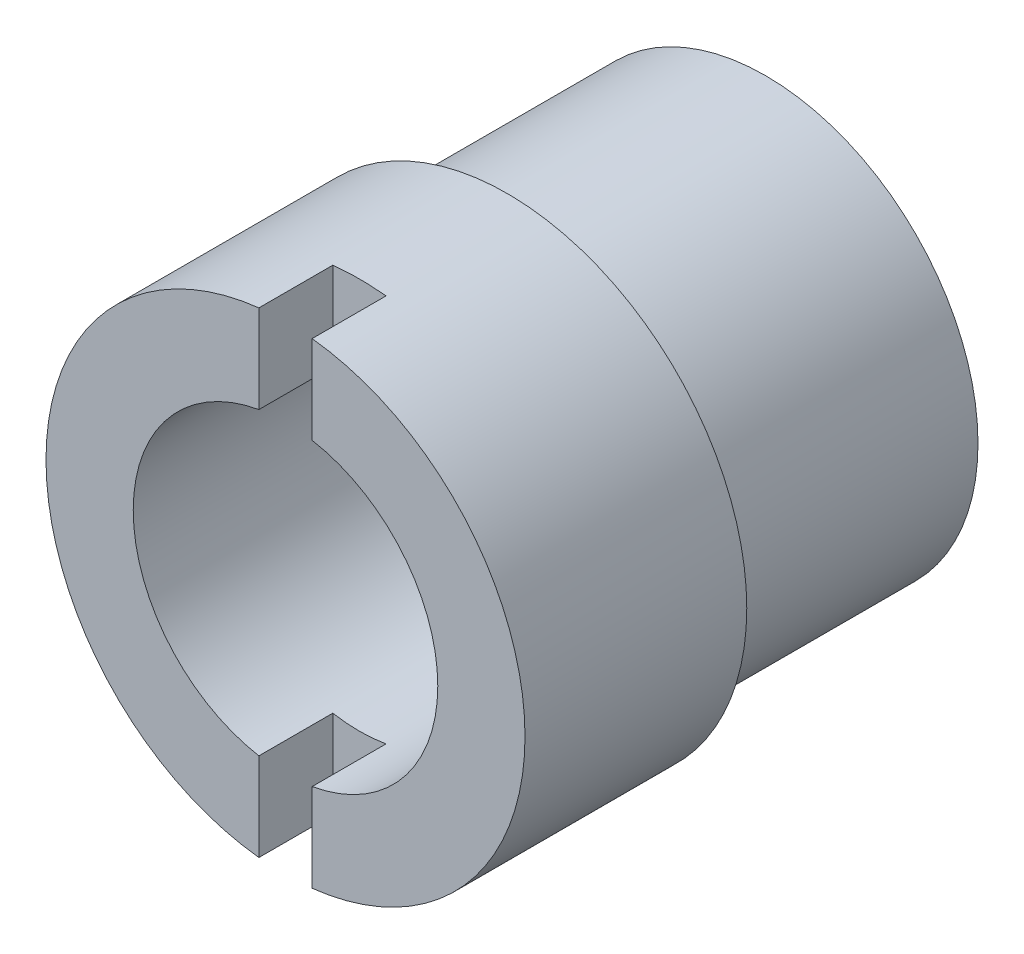
ISO-10303-21;
HEADER;
FILE_DESCRIPTION(('STEP AP214'),'2;1');
FILE_NAME('part.step','',(''),(''),'','','');
FILE_SCHEMA(('AUTOMOTIVE_DESIGN { 1 0 10303 214 1 1 1 1 }'));
ENDSEC;
DATA;
#1=APPLICATION_CONTEXT('core data for automotive mechanical design processes');
#2=APPLICATION_PROTOCOL_DEFINITION('international standard','automotive_design',2000,#1);
#3=PRODUCT_CONTEXT('',#1,'mechanical');
#4=PRODUCT('Part','Part','',(#3));
#5=PRODUCT_RELATED_PRODUCT_CATEGORY('part','',(#4));
#6=PRODUCT_DEFINITION_FORMATION('','',#4);
#7=PRODUCT_DEFINITION_CONTEXT('part definition',#1,'design');
#8=PRODUCT_DEFINITION('design','',#6,#7);
#9=PRODUCT_DEFINITION_SHAPE('','',#8);
#10=(LENGTH_UNIT() NAMED_UNIT(*) SI_UNIT(.MILLI.,.METRE.));
#11=(NAMED_UNIT(*) PLANE_ANGLE_UNIT() SI_UNIT($,.RADIAN.));
#12=(NAMED_UNIT(*) SI_UNIT($,.STERADIAN.) SOLID_ANGLE_UNIT());
#13=UNCERTAINTY_MEASURE_WITH_UNIT(LENGTH_MEASURE(1.E-05),#10,'distance_accuracy_value','');
#14=(GEOMETRIC_REPRESENTATION_CONTEXT(3) GLOBAL_UNCERTAINTY_ASSIGNED_CONTEXT((#13)) GLOBAL_UNIT_ASSIGNED_CONTEXT((#10,
#11,#12)) REPRESENTATION_CONTEXT('',''));
#15=CARTESIAN_POINT('',(0.,0.,0.));
#16=DIRECTION('',(0.,0.,1.));
#17=DIRECTION('',(1.,0.,0.));
#18=AXIS2_PLACEMENT_3D('',#15,#16,#17);
#19=CARTESIAN_POINT('',(0.,0.,0.));
#20=DIRECTION('',(0.,0.,1.));
#21=DIRECTION('',(1.,0.,0.));
#22=AXIS2_PLACEMENT_3D('',#19,#20,#21);
#23=PLANE('',#22);
#24=DIRECTION('',(0.,1.,0.));
#25=VECTOR('',#24,1.);
#26=CARTESIAN_POINT('',(-1.143,-14.4399,0.));
#27=LINE('',#26,#25);
#28=CARTESIAN_POINT('',(-1.143,6.43985180341908,0.));
#29=VERTEX_POINT('',#28);
#30=CARTESIAN_POINT('',(-1.143,10.223302793129,0.));
#31=VERTEX_POINT('',#30);
#32=EDGE_CURVE('E129',#29,#31,#27,.T.);
#33=ORIENTED_EDGE('',*,*,#32,.T.);
#34=CARTESIAN_POINT('',(0.,0.,0.));
#35=DIRECTION('',(0.,0.,1.));
#36=DIRECTION('',(1.,0.,0.));
#37=AXIS2_PLACEMENT_3D('',#34,#35,#36);
#38=CIRCLE('',#37,10.287);
#39=CARTESIAN_POINT('',(-1.143,-10.223302793129,0.));
#40=VERTEX_POINT('',#39);
#41=EDGE_CURVE('E136',#31,#40,#38,.T.);
#42=ORIENTED_EDGE('',*,*,#41,.T.);
#43=CARTESIAN_POINT('',(-1.143,-6.43985180341908,0.));
#44=VERTEX_POINT('',#43);
#45=EDGE_CURVE('E115',#40,#44,#27,.T.);
#46=ORIENTED_EDGE('',*,*,#45,.T.);
#47=CARTESIAN_POINT('',(0.,0.,0.));
#48=DIRECTION('',(0.,0.,1.));
#49=DIRECTION('',(1.,0.,0.));
#50=AXIS2_PLACEMENT_3D('',#47,#48,#49);
#51=CIRCLE('',#50,6.5405);
#52=EDGE_CURVE('E154',#29,#44,#51,.T.);
#53=ORIENTED_EDGE('',*,*,#52,.F.);
#54=EDGE_LOOP('',(#33,#42,#46,#53));
#55=FACE_BOUND('',#54,.T.);
#56=ADVANCED_FACE('F50',(#55),#23,.T.);
#57=CARTESIAN_POINT('',(0.,0.,-9.525));
#58=DIRECTION('',(0.,0.,1.));
#59=DIRECTION('',(1.,0.,0.));
#60=AXIS2_PLACEMENT_3D('',#57,#58,#59);
#61=CYLINDRICAL_SURFACE('',#60,10.287);
#62=DIRECTION('',(0.,0.,1.));
#63=VECTOR('',#62,1.);
#64=CARTESIAN_POINT('',(-1.143,10.223302793129,-9.525));
#65=LINE('',#64,#63);
#66=CARTESIAN_POINT('',(-1.143,10.223302793129,-3.175));
#67=VERTEX_POINT('',#66);
#68=EDGE_CURVE('E141',#67,#31,#65,.T.);
#69=ORIENTED_EDGE('',*,*,#68,.F.);
#70=CARTESIAN_POINT('',(0.,0.,-3.175));
#71=DIRECTION('',(0.,0.,-1.));
#72=DIRECTION('',(-1.,0.,0.));
#73=AXIS2_PLACEMENT_3D('',#70,#71,#72);
#74=CIRCLE('',#73,10.287);
#75=CARTESIAN_POINT('',(1.143,10.223302793129,-3.175));
#76=VERTEX_POINT('',#75);
#77=EDGE_CURVE('E180',#76,#67,#74,.F.);
#78=ORIENTED_EDGE('',*,*,#77,.F.);
#79=DIRECTION('',(0.,0.,1.));
#80=VECTOR('',#79,1.);
#81=CARTESIAN_POINT('',(1.143,10.223302793129,-9.525));
#82=LINE('',#81,#80);
#83=CARTESIAN_POINT('',(1.143,10.223302793129,0.));
#84=VERTEX_POINT('',#83);
#85=EDGE_CURVE('E198',#84,#76,#82,.F.);
#86=ORIENTED_EDGE('',*,*,#85,.F.);
#87=CARTESIAN_POINT('',(1.143,-10.223302793129,0.));
#88=VERTEX_POINT('',#87);
#89=EDGE_CURVE('E146',#88,#84,#38,.T.);
#90=ORIENTED_EDGE('',*,*,#89,.F.);
#91=DIRECTION('',(0.,0.,1.));
#92=VECTOR('',#91,1.);
#93=CARTESIAN_POINT('',(1.143,-10.223302793129,-9.525));
#94=LINE('',#93,#92);
#95=CARTESIAN_POINT('',(1.143,-10.223302793129,-3.175));
#96=VERTEX_POINT('',#95);
#97=EDGE_CURVE('E188',#96,#88,#94,.T.);
#98=ORIENTED_EDGE('',*,*,#97,.F.);
#99=CARTESIAN_POINT('',(-1.143,-10.223302793129,-3.175));
#100=VERTEX_POINT('',#99);
#101=EDGE_CURVE('E138',#100,#96,#74,.F.);
#102=ORIENTED_EDGE('',*,*,#101,.F.);
#103=DIRECTION('',(0.,0.,1.));
#104=VECTOR('',#103,1.);
#105=CARTESIAN_POINT('',(-1.143,-10.223302793129,-9.525));
#106=LINE('',#105,#104);
#107=EDGE_CURVE('E119',#40,#100,#106,.F.);
#108=ORIENTED_EDGE('',*,*,#107,.F.);
#109=ORIENTED_EDGE('',*,*,#41,.F.);
#110=EDGE_LOOP('',(#69,#78,#86,#90,#98,#102,#108,#109));
#111=FACE_BOUND('',#110,.T.);
#112=CARTESIAN_POINT('',(0.,0.,-9.525));
#113=DIRECTION('',(0.,0.,1.));
#114=DIRECTION('',(1.,0.,0.));
#115=AXIS2_PLACEMENT_3D('',#112,#113,#114);
#116=CIRCLE('',#115,10.287);
#117=CARTESIAN_POINT('',(10.287,0.,-9.525));
#118=VERTEX_POINT('',#117);
#119=EDGE_CURVE('E145',#118,#118,#116,.T.);
#120=ORIENTED_EDGE('',*,*,#119,.T.);
#121=EDGE_LOOP('',(#120));
#122=FACE_BOUND('',#121,.T.);
#123=ADVANCED_FACE('F52',(#111,#122),#61,.T.);
#124=CARTESIAN_POINT('',(0.,0.,-9.525));
#125=DIRECTION('',(0.,0.,1.));
#126=DIRECTION('',(1.,0.,0.));
#127=AXIS2_PLACEMENT_3D('',#124,#125,#126);
#128=PLANE('',#127);
#129=CARTESIAN_POINT('',(0.,0.,-9.525));
#130=DIRECTION('',(0.,0.,-1.));
#131=DIRECTION('',(-1.,0.,0.));
#132=AXIS2_PLACEMENT_3D('',#129,#130,#131);
#133=CIRCLE('',#132,9.1186);
#134=CARTESIAN_POINT('',(-9.1186,0.,-9.525));
#135=VERTEX_POINT('',#134);
#136=EDGE_CURVE('E151',#135,#135,#133,.T.);
#137=ORIENTED_EDGE('',*,*,#136,.F.);
#138=EDGE_LOOP('',(#137));
#139=FACE_BOUND('',#138,.T.);
#140=ORIENTED_EDGE('',*,*,#119,.F.);
#141=EDGE_LOOP('',(#140));
#142=FACE_BOUND('',#141,.T.);
#143=ADVANCED_FACE('F245',(#139,#142),#128,.F.);
#144=DIRECTION('',(0.,1.,0.));
#145=VECTOR('',#144,1.);
#146=CARTESIAN_POINT('',(1.143,-14.4399,0.));
#147=LINE('',#146,#145);
#148=CARTESIAN_POINT('',(1.143,-6.43985180341908,0.));
#149=VERTEX_POINT('',#148);
#150=EDGE_CURVE('E74',#88,#149,#147,.T.);
#151=ORIENTED_EDGE('',*,*,#150,.F.);
#152=ORIENTED_EDGE('',*,*,#89,.T.);
#153=CARTESIAN_POINT('',(1.143,6.43985180341908,0.));
#154=VERTEX_POINT('',#153);
#155=EDGE_CURVE('E128',#154,#84,#147,.T.);
#156=ORIENTED_EDGE('',*,*,#155,.F.);
#157=EDGE_CURVE('E212',#149,#154,#51,.T.);
#158=ORIENTED_EDGE('',*,*,#157,.F.);
#159=EDGE_LOOP('',(#151,#152,#156,#158));
#160=FACE_BOUND('',#159,.T.);
#161=ADVANCED_FACE('F226',(#160),#23,.T.);
#162=CARTESIAN_POINT('',(0.,0.,-9.525));
#163=DIRECTION('',(0.,0.,1.));
#164=DIRECTION('',(1.,0.,0.));
#165=AXIS2_PLACEMENT_3D('',#162,#163,#164);
#166=CYLINDRICAL_SURFACE('',#165,6.5405);
#167=CARTESIAN_POINT('',(0.,0.,-3.175));
#168=DIRECTION('',(0.,0.,-1.));
#169=DIRECTION('',(-1.,0.,0.));
#170=AXIS2_PLACEMENT_3D('',#167,#168,#169);
#171=CIRCLE('',#170,6.5405);
#172=CARTESIAN_POINT('',(1.143,6.43985180341908,-3.175));
#173=VERTEX_POINT('',#172);
#174=CARTESIAN_POINT('',(-1.143,6.43985180341908,-3.175));
#175=VERTEX_POINT('',#174);
#176=EDGE_CURVE('E59',#173,#175,#171,.F.);
#177=ORIENTED_EDGE('',*,*,#176,.T.);
#178=DIRECTION('',(0.,0.,1.));
#179=VECTOR('',#178,1.);
#180=CARTESIAN_POINT('',(-1.143,6.43985180341908,-9.525));
#181=LINE('',#180,#179);
#182=EDGE_CURVE('E12',#175,#29,#181,.T.);
#183=ORIENTED_EDGE('',*,*,#182,.T.);
#184=ORIENTED_EDGE('',*,*,#52,.T.);
#185=DIRECTION('',(0.,0.,1.));
#186=VECTOR('',#185,1.);
#187=CARTESIAN_POINT('',(-1.143,-6.43985180341908,-9.525));
#188=LINE('',#187,#186);
#189=CARTESIAN_POINT('',(-1.143,-6.43985180341908,-3.175));
#190=VERTEX_POINT('',#189);
#191=EDGE_CURVE('E122',#44,#190,#188,.F.);
#192=ORIENTED_EDGE('',*,*,#191,.T.);
#193=CARTESIAN_POINT('',(1.143,-6.43985180341908,-3.175));
#194=VERTEX_POINT('',#193);
#195=EDGE_CURVE('E160',#190,#194,#171,.F.);
#196=ORIENTED_EDGE('',*,*,#195,.T.);
#197=DIRECTION('',(0.,0.,1.));
#198=VECTOR('',#197,1.);
#199=CARTESIAN_POINT('',(1.143,-6.43985180341908,-9.525));
#200=LINE('',#199,#198);
#201=EDGE_CURVE('E157',#194,#149,#200,.T.);
#202=ORIENTED_EDGE('',*,*,#201,.T.);
#203=ORIENTED_EDGE('',*,*,#157,.T.);
#204=DIRECTION('',(0.,0.,1.));
#205=VECTOR('',#204,1.);
#206=CARTESIAN_POINT('',(1.143,6.43985180341908,-9.525));
#207=LINE('',#206,#205);
#208=EDGE_CURVE('E165',#154,#173,#207,.F.);
#209=ORIENTED_EDGE('',*,*,#208,.T.);
#210=EDGE_LOOP('',(#177,#183,#184,#192,#196,#202,#203,#209));
#211=FACE_BOUND('',#210,.T.);
#212=CARTESIAN_POINT('',(0.,0.,-20.6248));
#213=DIRECTION('',(0.,0.,-1.));
#214=DIRECTION('',(-1.,0.,0.));
#215=AXIS2_PLACEMENT_3D('',#212,#213,#214);
#216=CIRCLE('',#215,6.5405);
#217=CARTESIAN_POINT('',(-6.5405,0.,-20.6248));
#218=VERTEX_POINT('',#217);
#219=EDGE_CURVE('E140',#218,#218,#216,.T.);
#220=ORIENTED_EDGE('',*,*,#219,.T.);
#221=EDGE_LOOP('',(#220));
#222=FACE_BOUND('',#221,.T.);
#223=ADVANCED_FACE('F172',(#211,#222),#166,.F.);
#224=CARTESIAN_POINT('',(0.,0.,-20.6248));
#225=DIRECTION('',(0.,0.,-1.));
#226=DIRECTION('',(-1.,0.,0.));
#227=AXIS2_PLACEMENT_3D('',#224,#225,#226);
#228=PLANE('',#227);
#229=CARTESIAN_POINT('',(0.,0.,-20.6248));
#230=DIRECTION('',(0.,0.,-1.));
#231=DIRECTION('',(-1.,0.,0.));
#232=AXIS2_PLACEMENT_3D('',#229,#230,#231);
#233=CIRCLE('',#232,9.1186);
#234=CARTESIAN_POINT('',(-9.1186,0.,-20.6248));
#235=VERTEX_POINT('',#234);
#236=EDGE_CURVE('E208',#235,#235,#233,.T.);
#237=ORIENTED_EDGE('',*,*,#236,.T.);
#238=EDGE_LOOP('',(#237));
#239=FACE_BOUND('',#238,.T.);
#240=ORIENTED_EDGE('',*,*,#219,.F.);
#241=EDGE_LOOP('',(#240));
#242=FACE_BOUND('',#241,.T.);
#243=ADVANCED_FACE('F251',(#239,#242),#228,.T.);
#244=CARTESIAN_POINT('',(0.,0.,-20.6248));
#245=DIRECTION('',(0.,0.,1.));
#246=DIRECTION('',(1.,0.,0.));
#247=AXIS2_PLACEMENT_3D('',#244,#245,#246);
#248=CYLINDRICAL_SURFACE('',#247,9.1186);
#249=ORIENTED_EDGE('',*,*,#236,.F.);
#250=EDGE_LOOP('',(#249));
#251=FACE_BOUND('',#250,.T.);
#252=ORIENTED_EDGE('',*,*,#136,.T.);
#253=EDGE_LOOP('',(#252));
#254=FACE_BOUND('',#253,.T.);
#255=ADVANCED_FACE('F238',(#251,#254),#248,.T.);
#256=CARTESIAN_POINT('',(1.143,-14.4399,0.));
#257=DIRECTION('',(1.,0.,0.));
#258=DIRECTION('',(0.,0.,-1.));
#259=AXIS2_PLACEMENT_3D('',#256,#257,#258);
#260=PLANE('',#259);
#261=ORIENTED_EDGE('',*,*,#97,.T.);
#262=ORIENTED_EDGE('',*,*,#150,.T.);
#263=ORIENTED_EDGE('',*,*,#201,.F.);
#264=DIRECTION('',(0.,1.,0.));
#265=VECTOR('',#264,1.);
#266=CARTESIAN_POINT('',(1.143,-14.4399,-3.175));
#267=LINE('',#266,#265);
#268=EDGE_CURVE('E184',#96,#194,#267,.T.);
#269=ORIENTED_EDGE('',*,*,#268,.F.);
#270=EDGE_LOOP('',(#261,#262,#263,#269));
#271=FACE_BOUND('',#270,.T.);
#272=ADVANCED_FACE('F221',(#271),#260,.F.);
#273=CARTESIAN_POINT('',(-1.143,-14.4399,-3.175));
#274=DIRECTION('',(0.,0.,-1.));
#275=DIRECTION('',(-1.,0.,0.));
#276=AXIS2_PLACEMENT_3D('',#273,#274,#275);
#277=PLANE('',#276);
#278=ORIENTED_EDGE('',*,*,#101,.T.);
#279=ORIENTED_EDGE('',*,*,#268,.T.);
#280=ORIENTED_EDGE('',*,*,#195,.F.);
#281=DIRECTION('',(0.,1.,0.));
#282=VECTOR('',#281,1.);
#283=CARTESIAN_POINT('',(-1.143,-14.4399,-3.175));
#284=LINE('',#283,#282);
#285=EDGE_CURVE('E183',#100,#190,#284,.T.);
#286=ORIENTED_EDGE('',*,*,#285,.F.);
#287=EDGE_LOOP('',(#278,#279,#280,#286));
#288=FACE_BOUND('',#287,.T.);
#289=ADVANCED_FACE('F219',(#288),#277,.F.);
#290=CARTESIAN_POINT('',(-1.143,-14.4399,0.));
#291=DIRECTION('',(-1.,0.,0.));
#292=DIRECTION('',(0.,0.,1.));
#293=AXIS2_PLACEMENT_3D('',#290,#291,#292);
#294=PLANE('',#293);
#295=ORIENTED_EDGE('',*,*,#107,.T.);
#296=ORIENTED_EDGE('',*,*,#285,.T.);
#297=ORIENTED_EDGE('',*,*,#191,.F.);
#298=ORIENTED_EDGE('',*,*,#45,.F.);
#299=EDGE_LOOP('',(#295,#296,#297,#298));
#300=FACE_BOUND('',#299,.T.);
#301=ADVANCED_FACE('F117',(#300),#294,.F.);
#302=ORIENTED_EDGE('',*,*,#68,.T.);
#303=ORIENTED_EDGE('',*,*,#32,.F.);
#304=ORIENTED_EDGE('',*,*,#182,.F.);
#305=EDGE_CURVE('E179',#175,#67,#284,.T.);
#306=ORIENTED_EDGE('',*,*,#305,.T.);
#307=EDGE_LOOP('',(#302,#303,#304,#306));
#308=FACE_BOUND('',#307,.T.);
#309=ADVANCED_FACE('F234',(#308),#294,.F.);
#310=ORIENTED_EDGE('',*,*,#77,.T.);
#311=ORIENTED_EDGE('',*,*,#305,.F.);
#312=ORIENTED_EDGE('',*,*,#176,.F.);
#313=EDGE_CURVE('E66',#173,#76,#267,.T.);
#314=ORIENTED_EDGE('',*,*,#313,.T.);
#315=EDGE_LOOP('',(#310,#311,#312,#314));
#316=FACE_BOUND('',#315,.T.);
#317=ADVANCED_FACE('F176',(#316),#277,.F.);
#318=ORIENTED_EDGE('',*,*,#85,.T.);
#319=ORIENTED_EDGE('',*,*,#313,.F.);
#320=ORIENTED_EDGE('',*,*,#208,.F.);
#321=ORIENTED_EDGE('',*,*,#155,.T.);
#322=EDGE_LOOP('',(#318,#319,#320,#321));
#323=FACE_BOUND('',#322,.T.);
#324=ADVANCED_FACE('F228',(#323),#260,.F.);
#325=CLOSED_SHELL('',(#56,#123,#143,#161,#223,#243,#255,#272,#289,#301,#309,#317,#324));
#326=MANIFOLD_SOLID_BREP('B2',#325);
#327=ADVANCED_BREP_SHAPE_REPRESENTATION('',(#18,#326),#14);
#328=SHAPE_DEFINITION_REPRESENTATION(#9,#327);
ENDSEC;
END-ISO-10303-21;
